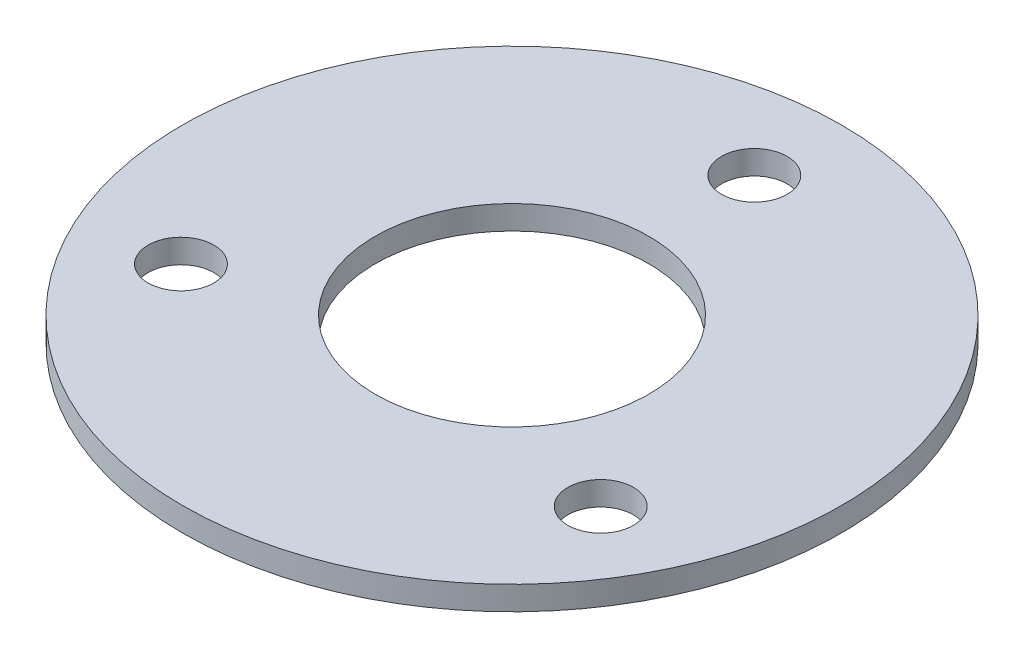
ISO-10303-21;
HEADER;
FILE_DESCRIPTION(('STEP AP214'),'2;1');
FILE_NAME('part.step','',(''),(''),'','','');
FILE_SCHEMA(('AUTOMOTIVE_DESIGN { 1 0 10303 214 1 1 1 1 }'));
ENDSEC;
DATA;
#1=APPLICATION_CONTEXT('core data for automotive mechanical design processes');
#2=APPLICATION_PROTOCOL_DEFINITION('international standard','automotive_design',2000,#1);
#3=PRODUCT_CONTEXT('',#1,'mechanical');
#4=PRODUCT('Part','Part','',(#3));
#5=PRODUCT_RELATED_PRODUCT_CATEGORY('part','',(#4));
#6=PRODUCT_DEFINITION_FORMATION('','',#4);
#7=PRODUCT_DEFINITION_CONTEXT('part definition',#1,'design');
#8=PRODUCT_DEFINITION('design','',#6,#7);
#9=PRODUCT_DEFINITION_SHAPE('','',#8);
#10=(LENGTH_UNIT() NAMED_UNIT(*) SI_UNIT(.MILLI.,.METRE.));
#11=(NAMED_UNIT(*) PLANE_ANGLE_UNIT() SI_UNIT($,.RADIAN.));
#12=(NAMED_UNIT(*) SI_UNIT($,.STERADIAN.) SOLID_ANGLE_UNIT());
#13=UNCERTAINTY_MEASURE_WITH_UNIT(LENGTH_MEASURE(1.E-05),#10,'distance_accuracy_value','');
#14=(GEOMETRIC_REPRESENTATION_CONTEXT(3) GLOBAL_UNCERTAINTY_ASSIGNED_CONTEXT((#13)) GLOBAL_UNIT_ASSIGNED_CONTEXT((#10,
#11,#12)) REPRESENTATION_CONTEXT('',''));
#15=CARTESIAN_POINT('',(0.,0.,0.));
#16=DIRECTION('',(0.,0.,1.));
#17=DIRECTION('',(1.,0.,0.));
#18=AXIS2_PLACEMENT_3D('',#15,#16,#17);
#19=CARTESIAN_POINT('',(0.,1.5621,0.));
#20=DIRECTION('',(0.,1.,0.));
#21=DIRECTION('',(0.,0.,1.));
#22=AXIS2_PLACEMENT_3D('',#19,#20,#21);
#23=PLANE('',#22);
#24=CARTESIAN_POINT('',(13.748153285079,1.5621,7.93749999999941));
#25=DIRECTION('',(0.,1.,0.));
#26=DIRECTION('',(0.,0.,1.));
#27=AXIS2_PLACEMENT_3D('',#24,#25,#26);
#28=CIRCLE('',#27,2.15265000000087);
#29=CARTESIAN_POINT('',(13.748153285079,1.5621,10.0901500000003));
#30=VERTEX_POINT('',#29);
#31=EDGE_CURVE('E53',#30,#30,#28,.T.);
#32=ORIENTED_EDGE('',*,*,#31,.F.);
#33=EDGE_LOOP('',(#32));
#34=FACE_BOUND('',#33,.T.);
#35=CARTESIAN_POINT('',(0.,1.5621,0.));
#36=DIRECTION('',(0.,1.,0.));
#37=DIRECTION('',(0.,0.,1.));
#38=AXIS2_PLACEMENT_3D('',#35,#36,#37);
#39=CIRCLE('',#38,8.9662);
#40=CARTESIAN_POINT('',(0.,1.5621,8.9662));
#41=VERTEX_POINT('',#40);
#42=EDGE_CURVE('E42',#41,#41,#39,.T.);
#43=ORIENTED_EDGE('',*,*,#42,.F.);
#44=EDGE_LOOP('',(#43));
#45=FACE_BOUND('',#44,.T.);
#46=CARTESIAN_POINT('',(0.,1.5621,0.));
#47=DIRECTION('',(0.,1.,0.));
#48=DIRECTION('',(0.,0.,1.));
#49=AXIS2_PLACEMENT_3D('',#46,#47,#48);
#50=CIRCLE('',#49,21.59);
#51=CARTESIAN_POINT('',(0.,1.5621,21.59));
#52=VERTEX_POINT('',#51);
#53=EDGE_CURVE('E10',#52,#52,#50,.T.);
#54=ORIENTED_EDGE('',*,*,#53,.T.);
#55=EDGE_LOOP('',(#54));
#56=FACE_BOUND('',#55,.T.);
#57=CARTESIAN_POINT('',(0.,1.5621,-15.875));
#58=DIRECTION('',(0.,1.,0.));
#59=DIRECTION('',(0.,0.,1.));
#60=AXIS2_PLACEMENT_3D('',#57,#58,#59);
#61=CIRCLE('',#60,2.15265);
#62=CARTESIAN_POINT('',(0.,1.5621,-13.72235));
#63=VERTEX_POINT('',#62);
#64=EDGE_CURVE('E47',#63,#63,#61,.T.);
#65=ORIENTED_EDGE('',*,*,#64,.F.);
#66=EDGE_LOOP('',(#65));
#67=FACE_BOUND('',#66,.T.);
#68=CARTESIAN_POINT('',(-13.7481532850769,1.5621,7.93750000000059));
#69=DIRECTION('',(0.,1.,0.));
#70=DIRECTION('',(0.,0.,1.));
#71=AXIS2_PLACEMENT_3D('',#68,#69,#70);
#72=CIRCLE('',#71,2.15265000000129);
#73=CARTESIAN_POINT('',(-13.7481532850769,1.5621,10.0901500000019));
#74=VERTEX_POINT('',#73);
#75=EDGE_CURVE('E59',#74,#74,#72,.T.);
#76=ORIENTED_EDGE('',*,*,#75,.F.);
#77=EDGE_LOOP('',(#76));
#78=FACE_BOUND('',#77,.T.);
#79=ADVANCED_FACE('F31',(#34,#45,#56,#67,#78),#23,.T.);
#80=CARTESIAN_POINT('',(0.,0.,0.));
#81=DIRECTION('',(0.,1.,0.));
#82=DIRECTION('',(0.,0.,1.));
#83=AXIS2_PLACEMENT_3D('',#80,#81,#82);
#84=PLANE('',#83);
#85=CARTESIAN_POINT('',(0.,0.,0.));
#86=DIRECTION('',(0.,1.,0.));
#87=DIRECTION('',(0.,0.,1.));
#88=AXIS2_PLACEMENT_3D('',#85,#86,#87);
#89=CIRCLE('',#88,21.59);
#90=CARTESIAN_POINT('',(0.,0.,21.59));
#91=VERTEX_POINT('',#90);
#92=EDGE_CURVE('E35',#91,#91,#89,.T.);
#93=ORIENTED_EDGE('',*,*,#92,.F.);
#94=EDGE_LOOP('',(#93));
#95=FACE_BOUND('',#94,.T.);
#96=CARTESIAN_POINT('',(0.,0.,0.));
#97=DIRECTION('',(0.,1.,0.));
#98=DIRECTION('',(0.,0.,1.));
#99=AXIS2_PLACEMENT_3D('',#96,#97,#98);
#100=CIRCLE('',#99,8.9662);
#101=CARTESIAN_POINT('',(0.,0.,8.9662));
#102=VERTEX_POINT('',#101);
#103=EDGE_CURVE('E44',#102,#102,#100,.T.);
#104=ORIENTED_EDGE('',*,*,#103,.T.);
#105=EDGE_LOOP('',(#104));
#106=FACE_BOUND('',#105,.T.);
#107=CARTESIAN_POINT('',(0.,0.,-15.875));
#108=DIRECTION('',(0.,1.,0.));
#109=DIRECTION('',(0.,0.,1.));
#110=AXIS2_PLACEMENT_3D('',#107,#108,#109);
#111=CIRCLE('',#110,2.15265);
#112=CARTESIAN_POINT('',(0.,0.,-13.72235));
#113=VERTEX_POINT('',#112);
#114=EDGE_CURVE('E50',#113,#113,#111,.T.);
#115=ORIENTED_EDGE('',*,*,#114,.T.);
#116=EDGE_LOOP('',(#115));
#117=FACE_BOUND('',#116,.T.);
#118=CARTESIAN_POINT('',(13.748153285079,0.,7.93749999999941));
#119=DIRECTION('',(0.,1.,0.));
#120=DIRECTION('',(0.,0.,1.));
#121=AXIS2_PLACEMENT_3D('',#118,#119,#120);
#122=CIRCLE('',#121,2.15265000000087);
#123=CARTESIAN_POINT('',(13.748153285079,0.,10.0901500000003));
#124=VERTEX_POINT('',#123);
#125=EDGE_CURVE('E56',#124,#124,#122,.T.);
#126=ORIENTED_EDGE('',*,*,#125,.T.);
#127=EDGE_LOOP('',(#126));
#128=FACE_BOUND('',#127,.T.);
#129=CARTESIAN_POINT('',(-13.7481532850769,0.,7.93750000000059));
#130=DIRECTION('',(0.,1.,0.));
#131=DIRECTION('',(0.,0.,1.));
#132=AXIS2_PLACEMENT_3D('',#129,#130,#131);
#133=CIRCLE('',#132,2.15265000000129);
#134=CARTESIAN_POINT('',(-13.7481532850769,0.,10.0901500000019));
#135=VERTEX_POINT('',#134);
#136=EDGE_CURVE('E62',#135,#135,#133,.T.);
#137=ORIENTED_EDGE('',*,*,#136,.T.);
#138=EDGE_LOOP('',(#137));
#139=FACE_BOUND('',#138,.T.);
#140=ADVANCED_FACE('F72',(#95,#106,#117,#128,#139),#84,.F.);
#141=CARTESIAN_POINT('',(0.,1.5621,0.));
#142=DIRECTION('',(0.,-1.,0.));
#143=DIRECTION('',(0.,0.,-1.));
#144=AXIS2_PLACEMENT_3D('',#141,#142,#143);
#145=CYLINDRICAL_SURFACE('',#144,21.59);
#146=ORIENTED_EDGE('',*,*,#53,.F.);
#147=EDGE_LOOP('',(#146));
#148=FACE_BOUND('',#147,.T.);
#149=ORIENTED_EDGE('',*,*,#92,.T.);
#150=EDGE_LOOP('',(#149));
#151=FACE_BOUND('',#150,.T.);
#152=ADVANCED_FACE('F33',(#148,#151),#145,.T.);
#153=CARTESIAN_POINT('',(0.,1.5621,0.));
#154=DIRECTION('',(0.,-1.,0.));
#155=DIRECTION('',(0.,0.,-1.));
#156=AXIS2_PLACEMENT_3D('',#153,#154,#155);
#157=CYLINDRICAL_SURFACE('',#156,8.9662);
#158=ORIENTED_EDGE('',*,*,#42,.T.);
#159=EDGE_LOOP('',(#158));
#160=FACE_BOUND('',#159,.T.);
#161=ORIENTED_EDGE('',*,*,#103,.F.);
#162=EDGE_LOOP('',(#161));
#163=FACE_BOUND('',#162,.T.);
#164=ADVANCED_FACE('F82',(#160,#163),#157,.F.);
#165=CARTESIAN_POINT('',(0.,1.5621,-15.875));
#166=DIRECTION('',(0.,-1.,0.));
#167=DIRECTION('',(0.,0.,-1.));
#168=AXIS2_PLACEMENT_3D('',#165,#166,#167);
#169=CYLINDRICAL_SURFACE('',#168,2.15265);
#170=ORIENTED_EDGE('',*,*,#64,.T.);
#171=EDGE_LOOP('',(#170));
#172=FACE_BOUND('',#171,.T.);
#173=ORIENTED_EDGE('',*,*,#114,.F.);
#174=EDGE_LOOP('',(#173));
#175=FACE_BOUND('',#174,.T.);
#176=ADVANCED_FACE('F85',(#172,#175),#169,.F.);
#177=CARTESIAN_POINT('',(13.748153285079,1.5621,7.93749999999941));
#178=DIRECTION('',(0.,-1.,0.));
#179=DIRECTION('',(0.,0.,-1.));
#180=AXIS2_PLACEMENT_3D('',#177,#178,#179);
#181=CYLINDRICAL_SURFACE('',#180,2.15265000000087);
#182=ORIENTED_EDGE('',*,*,#31,.T.);
#183=EDGE_LOOP('',(#182));
#184=FACE_BOUND('',#183,.T.);
#185=ORIENTED_EDGE('',*,*,#125,.F.);
#186=EDGE_LOOP('',(#185));
#187=FACE_BOUND('',#186,.T.);
#188=ADVANCED_FACE('F89',(#184,#187),#181,.F.);
#189=CARTESIAN_POINT('',(-13.7481532850769,1.5621,7.93750000000059));
#190=DIRECTION('',(0.,-1.,0.));
#191=DIRECTION('',(0.,0.,-1.));
#192=AXIS2_PLACEMENT_3D('',#189,#190,#191);
#193=CYLINDRICAL_SURFACE('',#192,2.15265000000129);
#194=ORIENTED_EDGE('',*,*,#75,.T.);
#195=EDGE_LOOP('',(#194));
#196=FACE_BOUND('',#195,.T.);
#197=ORIENTED_EDGE('',*,*,#136,.F.);
#198=EDGE_LOOP('',(#197));
#199=FACE_BOUND('',#198,.T.);
#200=ADVANCED_FACE('F68',(#196,#199),#193,.F.);
#201=CLOSED_SHELL('',(#79,#140,#152,#164,#176,#188,#200));
#202=MANIFOLD_SOLID_BREP('B2',#201);
#203=ADVANCED_BREP_SHAPE_REPRESENTATION('',(#18,#202),#14);
#204=SHAPE_DEFINITION_REPRESENTATION(#9,#203);
ENDSEC;
END-ISO-10303-21;
